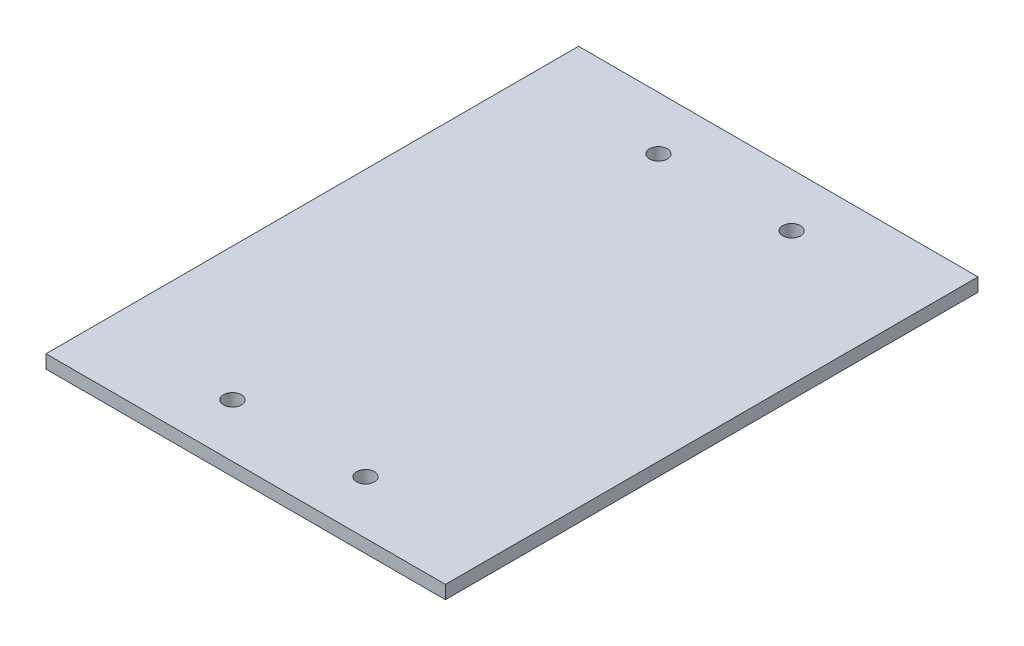
ISO-10303-21;
HEADER;
FILE_DESCRIPTION(('STEP AP214'),'2;1');
FILE_NAME('part.step','',(''),(''),'','','');
FILE_SCHEMA(('AUTOMOTIVE_DESIGN { 1 0 10303 214 1 1 1 1 }'));
ENDSEC;
DATA;
#1=APPLICATION_CONTEXT('core data for automotive mechanical design processes');
#2=APPLICATION_PROTOCOL_DEFINITION('international standard','automotive_design',2000,#1);
#3=PRODUCT_CONTEXT('',#1,'mechanical');
#4=PRODUCT('Part','Part','',(#3));
#5=PRODUCT_RELATED_PRODUCT_CATEGORY('part','',(#4));
#6=PRODUCT_DEFINITION_FORMATION('','',#4);
#7=PRODUCT_DEFINITION_CONTEXT('part definition',#1,'design');
#8=PRODUCT_DEFINITION('design','',#6,#7);
#9=PRODUCT_DEFINITION_SHAPE('','',#8);
#10=(LENGTH_UNIT() NAMED_UNIT(*) SI_UNIT(.MILLI.,.METRE.));
#11=(NAMED_UNIT(*) PLANE_ANGLE_UNIT() SI_UNIT($,.RADIAN.));
#12=(NAMED_UNIT(*) SI_UNIT($,.STERADIAN.) SOLID_ANGLE_UNIT());
#13=UNCERTAINTY_MEASURE_WITH_UNIT(LENGTH_MEASURE(1.E-05),#10,'distance_accuracy_value','');
#14=(GEOMETRIC_REPRESENTATION_CONTEXT(3) GLOBAL_UNCERTAINTY_ASSIGNED_CONTEXT((#13)) GLOBAL_UNIT_ASSIGNED_CONTEXT((#10,
#11,#12)) REPRESENTATION_CONTEXT('',''));
#15=CARTESIAN_POINT('',(0.,0.,0.));
#16=DIRECTION('',(0.,0.,1.));
#17=DIRECTION('',(1.,0.,0.));
#18=AXIS2_PLACEMENT_3D('',#15,#16,#17);
#19=CARTESIAN_POINT('',(0.,2.54,0.));
#20=DIRECTION('',(0.,1.,0.));
#21=DIRECTION('',(0.,0.,1.));
#22=AXIS2_PLACEMENT_3D('',#19,#20,#21);
#23=PLANE('',#22);
#24=CARTESIAN_POINT('',(12.7,2.54,40.64));
#25=DIRECTION('',(0.,1.,0.));
#26=DIRECTION('',(0.,0.,-1.));
#27=AXIS2_PLACEMENT_3D('',#24,#25,#26);
#28=CIRCLE('',#27,1.7);
#29=CARTESIAN_POINT('',(12.7,2.54,38.94));
#30=VERTEX_POINT('',#29);
#31=EDGE_CURVE('E121',#30,#30,#28,.T.);
#32=ORIENTED_EDGE('',*,*,#31,.F.);
#33=EDGE_LOOP('',(#32));
#34=FACE_BOUND('',#33,.T.);
#35=CARTESIAN_POINT('',(-12.7,2.54,-40.64));
#36=DIRECTION('',(0.,1.,0.));
#37=DIRECTION('',(0.,0.,1.));
#38=AXIS2_PLACEMENT_3D('',#35,#36,#37);
#39=CIRCLE('',#38,1.7);
#40=CARTESIAN_POINT('',(-12.7,2.54,-38.94));
#41=VERTEX_POINT('',#40);
#42=EDGE_CURVE('E100',#41,#41,#39,.T.);
#43=ORIENTED_EDGE('',*,*,#42,.F.);
#44=EDGE_LOOP('',(#43));
#45=FACE_BOUND('',#44,.T.);
#46=DIRECTION('',(0.,0.,-1.));
#47=VECTOR('',#46,1.);
#48=CARTESIAN_POINT('',(38.1,2.54,-50.8));
#49=LINE('',#48,#47);
#50=CARTESIAN_POINT('',(38.1,2.54,50.8));
#51=VERTEX_POINT('',#50);
#52=CARTESIAN_POINT('',(38.1,2.54,-50.8));
#53=VERTEX_POINT('',#52);
#54=EDGE_CURVE('E85',#51,#53,#49,.T.);
#55=ORIENTED_EDGE('',*,*,#54,.T.);
#56=DIRECTION('',(-1.,0.,0.));
#57=VECTOR('',#56,1.);
#58=CARTESIAN_POINT('',(-38.1,2.54,-50.8));
#59=LINE('',#58,#57);
#60=CARTESIAN_POINT('',(-38.1,2.54,-50.8));
#61=VERTEX_POINT('',#60);
#62=EDGE_CURVE('E80',#53,#61,#59,.T.);
#63=ORIENTED_EDGE('',*,*,#62,.T.);
#64=DIRECTION('',(0.,0.,1.));
#65=VECTOR('',#64,1.);
#66=CARTESIAN_POINT('',(-38.1,2.54,-50.8));
#67=LINE('',#66,#65);
#68=CARTESIAN_POINT('',(-38.1,2.54,50.8));
#69=VERTEX_POINT('',#68);
#70=EDGE_CURVE('E83',#61,#69,#67,.T.);
#71=ORIENTED_EDGE('',*,*,#70,.T.);
#72=DIRECTION('',(1.,0.,0.));
#73=VECTOR('',#72,1.);
#74=CARTESIAN_POINT('',(-38.1,2.54,50.8));
#75=LINE('',#74,#73);
#76=EDGE_CURVE('E50',#69,#51,#75,.T.);
#77=ORIENTED_EDGE('',*,*,#76,.T.);
#78=EDGE_LOOP('',(#55,#63,#71,#77));
#79=FACE_BOUND('',#78,.T.);
#80=CARTESIAN_POINT('',(12.7,2.54,-40.64));
#81=DIRECTION('',(0.,1.,0.));
#82=DIRECTION('',(0.,0.,1.));
#83=AXIS2_PLACEMENT_3D('',#80,#81,#82);
#84=CIRCLE('',#83,1.7);
#85=CARTESIAN_POINT('',(12.7,2.54,-38.94));
#86=VERTEX_POINT('',#85);
#87=EDGE_CURVE('E115',#86,#86,#84,.T.);
#88=ORIENTED_EDGE('',*,*,#87,.F.);
#89=EDGE_LOOP('',(#88));
#90=FACE_BOUND('',#89,.T.);
#91=CARTESIAN_POINT('',(-12.7,2.54,40.64));
#92=DIRECTION('',(0.,1.,0.));
#93=DIRECTION('',(0.,0.,-1.));
#94=AXIS2_PLACEMENT_3D('',#91,#92,#93);
#95=CIRCLE('',#94,1.7);
#96=CARTESIAN_POINT('',(-12.7,2.54,38.94));
#97=VERTEX_POINT('',#96);
#98=EDGE_CURVE('E127',#97,#97,#95,.T.);
#99=ORIENTED_EDGE('',*,*,#98,.F.);
#100=EDGE_LOOP('',(#99));
#101=FACE_BOUND('',#100,.T.);
#102=ADVANCED_FACE('F33',(#34,#45,#79,#90,#101),#23,.T.);
#103=CARTESIAN_POINT('',(0.,0.,0.));
#104=DIRECTION('',(0.,1.,0.));
#105=DIRECTION('',(0.,0.,1.));
#106=AXIS2_PLACEMENT_3D('',#103,#104,#105);
#107=PLANE('',#106);
#108=DIRECTION('',(0.,0.,-1.));
#109=VECTOR('',#108,1.);
#110=CARTESIAN_POINT('',(38.1,0.,-50.8));
#111=LINE('',#110,#109);
#112=CARTESIAN_POINT('',(38.1,0.,50.8));
#113=VERTEX_POINT('',#112);
#114=CARTESIAN_POINT('',(38.1,0.,-50.8));
#115=VERTEX_POINT('',#114);
#116=EDGE_CURVE('E97',#113,#115,#111,.T.);
#117=ORIENTED_EDGE('',*,*,#116,.F.);
#118=DIRECTION('',(1.,0.,0.));
#119=VECTOR('',#118,1.);
#120=CARTESIAN_POINT('',(-38.1,0.,50.8));
#121=LINE('',#120,#119);
#122=CARTESIAN_POINT('',(-38.1,0.,50.8));
#123=VERTEX_POINT('',#122);
#124=EDGE_CURVE('E73',#123,#113,#121,.T.);
#125=ORIENTED_EDGE('',*,*,#124,.F.);
#126=DIRECTION('',(0.,0.,1.));
#127=VECTOR('',#126,1.);
#128=CARTESIAN_POINT('',(-38.1,0.,-50.8));
#129=LINE('',#128,#127);
#130=CARTESIAN_POINT('',(-38.1,0.,-50.8));
#131=VERTEX_POINT('',#130);
#132=EDGE_CURVE('E67',#131,#123,#129,.T.);
#133=ORIENTED_EDGE('',*,*,#132,.F.);
#134=DIRECTION('',(-1.,0.,0.));
#135=VECTOR('',#134,1.);
#136=CARTESIAN_POINT('',(-38.1,0.,-50.8));
#137=LINE('',#136,#135);
#138=EDGE_CURVE('E89',#115,#131,#137,.T.);
#139=ORIENTED_EDGE('',*,*,#138,.F.);
#140=EDGE_LOOP('',(#117,#125,#133,#139));
#141=FACE_BOUND('',#140,.T.);
#142=CARTESIAN_POINT('',(-12.7,0.,-40.64));
#143=DIRECTION('',(0.,1.,0.));
#144=DIRECTION('',(0.,0.,1.));
#145=AXIS2_PLACEMENT_3D('',#142,#143,#144);
#146=CIRCLE('',#145,1.7);
#147=CARTESIAN_POINT('',(-12.7,0.,-38.94));
#148=VERTEX_POINT('',#147);
#149=EDGE_CURVE('E112',#148,#148,#146,.T.);
#150=ORIENTED_EDGE('',*,*,#149,.T.);
#151=EDGE_LOOP('',(#150));
#152=FACE_BOUND('',#151,.T.);
#153=CARTESIAN_POINT('',(12.7,0.,-40.64));
#154=DIRECTION('',(0.,1.,0.));
#155=DIRECTION('',(0.,0.,1.));
#156=AXIS2_PLACEMENT_3D('',#153,#154,#155);
#157=CIRCLE('',#156,1.7);
#158=CARTESIAN_POINT('',(12.7,0.,-38.94));
#159=VERTEX_POINT('',#158);
#160=EDGE_CURVE('E118',#159,#159,#157,.T.);
#161=ORIENTED_EDGE('',*,*,#160,.T.);
#162=EDGE_LOOP('',(#161));
#163=FACE_BOUND('',#162,.T.);
#164=CARTESIAN_POINT('',(12.7,0.,40.64));
#165=DIRECTION('',(0.,1.,0.));
#166=DIRECTION('',(0.,0.,-1.));
#167=AXIS2_PLACEMENT_3D('',#164,#165,#166);
#168=CIRCLE('',#167,1.7);
#169=CARTESIAN_POINT('',(12.7,0.,38.94));
#170=VERTEX_POINT('',#169);
#171=EDGE_CURVE('E124',#170,#170,#168,.T.);
#172=ORIENTED_EDGE('',*,*,#171,.T.);
#173=EDGE_LOOP('',(#172));
#174=FACE_BOUND('',#173,.T.);
#175=CARTESIAN_POINT('',(-12.7,0.,40.64));
#176=DIRECTION('',(0.,1.,0.));
#177=DIRECTION('',(0.,0.,-1.));
#178=AXIS2_PLACEMENT_3D('',#175,#176,#177);
#179=CIRCLE('',#178,1.7);
#180=CARTESIAN_POINT('',(-12.7,0.,38.94));
#181=VERTEX_POINT('',#180);
#182=EDGE_CURVE('E130',#181,#181,#179,.T.);
#183=ORIENTED_EDGE('',*,*,#182,.T.);
#184=EDGE_LOOP('',(#183));
#185=FACE_BOUND('',#184,.T.);
#186=ADVANCED_FACE('F108',(#141,#152,#163,#174,#185),#107,.F.);
#187=CARTESIAN_POINT('',(38.1,2.54,-50.8));
#188=DIRECTION('',(-1.,0.,0.));
#189=DIRECTION('',(0.,0.,1.));
#190=AXIS2_PLACEMENT_3D('',#187,#188,#189);
#191=PLANE('',#190);
#192=ORIENTED_EDGE('',*,*,#116,.T.);
#193=DIRECTION('',(0.,-1.,0.));
#194=VECTOR('',#193,1.);
#195=CARTESIAN_POINT('',(38.1,2.54,-50.8));
#196=LINE('',#195,#194);
#197=EDGE_CURVE('E11',#53,#115,#196,.T.);
#198=ORIENTED_EDGE('',*,*,#197,.F.);
#199=ORIENTED_EDGE('',*,*,#54,.F.);
#200=DIRECTION('',(0.,-1.,0.));
#201=VECTOR('',#200,1.);
#202=CARTESIAN_POINT('',(38.1,2.54,50.8));
#203=LINE('',#202,#201);
#204=EDGE_CURVE('E93',#51,#113,#203,.T.);
#205=ORIENTED_EDGE('',*,*,#204,.T.);
#206=EDGE_LOOP('',(#192,#198,#199,#205));
#207=FACE_BOUND('',#206,.T.);
#208=ADVANCED_FACE('F35',(#207),#191,.F.);
#209=CARTESIAN_POINT('',(-38.1,2.54,-50.8));
#210=DIRECTION('',(0.,0.,1.));
#211=DIRECTION('',(1.,0.,0.));
#212=AXIS2_PLACEMENT_3D('',#209,#210,#211);
#213=PLANE('',#212);
#214=ORIENTED_EDGE('',*,*,#138,.T.);
#215=DIRECTION('',(0.,-1.,0.));
#216=VECTOR('',#215,1.);
#217=CARTESIAN_POINT('',(-38.1,2.54,-50.8));
#218=LINE('',#217,#216);
#219=EDGE_CURVE('E42',#61,#131,#218,.T.);
#220=ORIENTED_EDGE('',*,*,#219,.F.);
#221=ORIENTED_EDGE('',*,*,#62,.F.);
#222=ORIENTED_EDGE('',*,*,#197,.T.);
#223=EDGE_LOOP('',(#214,#220,#221,#222));
#224=FACE_BOUND('',#223,.T.);
#225=ADVANCED_FACE('F88',(#224),#213,.F.);
#226=CARTESIAN_POINT('',(-38.1,2.54,-50.8));
#227=DIRECTION('',(1.,0.,0.));
#228=DIRECTION('',(0.,0.,-1.));
#229=AXIS2_PLACEMENT_3D('',#226,#227,#228);
#230=PLANE('',#229);
#231=ORIENTED_EDGE('',*,*,#132,.T.);
#232=DIRECTION('',(0.,-1.,0.));
#233=VECTOR('',#232,1.);
#234=CARTESIAN_POINT('',(-38.1,2.54,50.8));
#235=LINE('',#234,#233);
#236=EDGE_CURVE('E90',#69,#123,#235,.T.);
#237=ORIENTED_EDGE('',*,*,#236,.F.);
#238=ORIENTED_EDGE('',*,*,#70,.F.);
#239=ORIENTED_EDGE('',*,*,#219,.T.);
#240=EDGE_LOOP('',(#231,#237,#238,#239));
#241=FACE_BOUND('',#240,.T.);
#242=ADVANCED_FACE('F91',(#241),#230,.F.);
#243=CARTESIAN_POINT('',(-38.1,2.54,50.8));
#244=DIRECTION('',(0.,0.,-1.));
#245=DIRECTION('',(-1.,0.,0.));
#246=AXIS2_PLACEMENT_3D('',#243,#244,#245);
#247=PLANE('',#246);
#248=ORIENTED_EDGE('',*,*,#124,.T.);
#249=ORIENTED_EDGE('',*,*,#204,.F.);
#250=ORIENTED_EDGE('',*,*,#76,.F.);
#251=ORIENTED_EDGE('',*,*,#236,.T.);
#252=EDGE_LOOP('',(#248,#249,#250,#251));
#253=FACE_BOUND('',#252,.T.);
#254=ADVANCED_FACE('F105',(#253),#247,.F.);
#255=CARTESIAN_POINT('',(-12.7,2.54,-40.64));
#256=DIRECTION('',(0.,-1.,0.));
#257=DIRECTION('',(0.,0.,-1.));
#258=AXIS2_PLACEMENT_3D('',#255,#256,#257);
#259=CYLINDRICAL_SURFACE('',#258,1.7);
#260=ORIENTED_EDGE('',*,*,#42,.T.);
#261=EDGE_LOOP('',(#260));
#262=FACE_BOUND('',#261,.T.);
#263=ORIENTED_EDGE('',*,*,#149,.F.);
#264=EDGE_LOOP('',(#263));
#265=FACE_BOUND('',#264,.T.);
#266=ADVANCED_FACE('F149',(#262,#265),#259,.F.);
#267=CARTESIAN_POINT('',(12.7,2.54,-40.64));
#268=DIRECTION('',(0.,-1.,0.));
#269=DIRECTION('',(0.,0.,-1.));
#270=AXIS2_PLACEMENT_3D('',#267,#268,#269);
#271=CYLINDRICAL_SURFACE('',#270,1.7);
#272=ORIENTED_EDGE('',*,*,#87,.T.);
#273=EDGE_LOOP('',(#272));
#274=FACE_BOUND('',#273,.T.);
#275=ORIENTED_EDGE('',*,*,#160,.F.);
#276=EDGE_LOOP('',(#275));
#277=FACE_BOUND('',#276,.T.);
#278=ADVANCED_FACE('F195',(#274,#277),#271,.F.);
#279=CARTESIAN_POINT('',(12.7,2.54,40.64));
#280=DIRECTION('',(0.,-1.,0.));
#281=DIRECTION('',(0.,0.,-1.));
#282=AXIS2_PLACEMENT_3D('',#279,#280,#281);
#283=CYLINDRICAL_SURFACE('',#282,1.7);
#284=ORIENTED_EDGE('',*,*,#31,.T.);
#285=EDGE_LOOP('',(#284));
#286=FACE_BOUND('',#285,.T.);
#287=ORIENTED_EDGE('',*,*,#171,.F.);
#288=EDGE_LOOP('',(#287));
#289=FACE_BOUND('',#288,.T.);
#290=ADVANCED_FACE('F203',(#286,#289),#283,.F.);
#291=CARTESIAN_POINT('',(-12.7,2.54,40.64));
#292=DIRECTION('',(0.,-1.,0.));
#293=DIRECTION('',(0.,0.,-1.));
#294=AXIS2_PLACEMENT_3D('',#291,#292,#293);
#295=CYLINDRICAL_SURFACE('',#294,1.7);
#296=ORIENTED_EDGE('',*,*,#98,.T.);
#297=EDGE_LOOP('',(#296));
#298=FACE_BOUND('',#297,.T.);
#299=ORIENTED_EDGE('',*,*,#182,.F.);
#300=EDGE_LOOP('',(#299));
#301=FACE_BOUND('',#300,.T.);
#302=ADVANCED_FACE('F136',(#298,#301),#295,.F.);
#303=CLOSED_SHELL('',(#102,#186,#208,#225,#242,#254,#266,#278,#290,#302));
#304=MANIFOLD_SOLID_BREP('B2',#303);
#305=ADVANCED_BREP_SHAPE_REPRESENTATION('',(#18,#304),#14);
#306=SHAPE_DEFINITION_REPRESENTATION(#9,#305);
ENDSEC;
END-ISO-10303-21;
